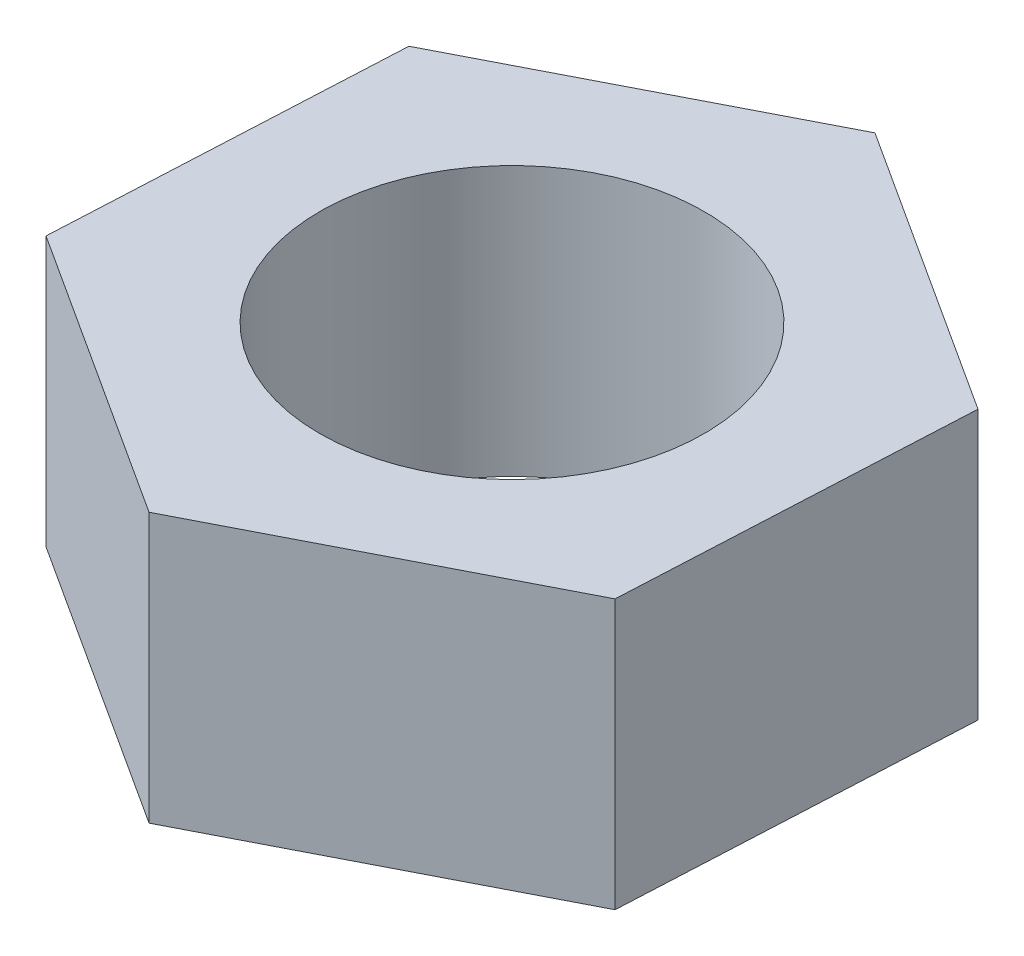
ISO-10303-21;
HEADER;
FILE_DESCRIPTION(('STEP AP214'),'2;1');
FILE_NAME('part.step','',(''),(''),'','','');
FILE_SCHEMA(('AUTOMOTIVE_DESIGN { 1 0 10303 214 1 1 1 1 }'));
ENDSEC;
DATA;
#1=APPLICATION_CONTEXT('core data for automotive mechanical design processes');
#2=APPLICATION_PROTOCOL_DEFINITION('international standard','automotive_design',2000,#1);
#3=PRODUCT_CONTEXT('',#1,'mechanical');
#4=PRODUCT('Part','Part','',(#3));
#5=PRODUCT_RELATED_PRODUCT_CATEGORY('part','',(#4));
#6=PRODUCT_DEFINITION_FORMATION('','',#4);
#7=PRODUCT_DEFINITION_CONTEXT('part definition',#1,'design');
#8=PRODUCT_DEFINITION('design','',#6,#7);
#9=PRODUCT_DEFINITION_SHAPE('','',#8);
#10=(LENGTH_UNIT() NAMED_UNIT(*) SI_UNIT(.MILLI.,.METRE.));
#11=(NAMED_UNIT(*) PLANE_ANGLE_UNIT() SI_UNIT($,.RADIAN.));
#12=(NAMED_UNIT(*) SI_UNIT($,.STERADIAN.) SOLID_ANGLE_UNIT());
#13=UNCERTAINTY_MEASURE_WITH_UNIT(LENGTH_MEASURE(1.E-05),#10,'distance_accuracy_value','');
#14=(GEOMETRIC_REPRESENTATION_CONTEXT(3) GLOBAL_UNCERTAINTY_ASSIGNED_CONTEXT((#13)) GLOBAL_UNIT_ASSIGNED_CONTEXT((#10,
#11,#12)) REPRESENTATION_CONTEXT('',''));
#15=CARTESIAN_POINT('',(0.,0.,0.));
#16=DIRECTION('',(0.,0.,1.));
#17=DIRECTION('',(1.,0.,0.));
#18=AXIS2_PLACEMENT_3D('',#15,#16,#17);
#19=CARTESIAN_POINT('',(-0.223564758111544,3.5,4.49444310220193));
#20=DIRECTION('',(-0.456357509152321,0.,-0.889796506983641));
#21=DIRECTION('',(-0.889796506983641,0.,0.456357509152321));
#22=AXIS2_PLACEMENT_3D('',#19,#20,#21);
#23=PLANE('',#22);
#24=DIRECTION('',(0.889796506983641,0.,-0.456357509152321));
#25=VECTOR('',#24,1.);
#26=CARTESIAN_POINT('',(-0.223564758111544,0.,4.49444310220193));
#27=LINE('',#26,#25);
#28=CARTESIAN_POINT('',(-0.223564758111544,0.,4.49444310220193));
#29=VERTEX_POINT('',#28);
#30=CARTESIAN_POINT('',(3.78051952331484,0.,2.44083431101649));
#31=VERTEX_POINT('',#30);
#32=EDGE_CURVE('E117',#29,#31,#27,.T.);
#33=ORIENTED_EDGE('',*,*,#32,.T.);
#34=DIRECTION('',(0.,-1.,0.));
#35=VECTOR('',#34,1.);
#36=CARTESIAN_POINT('',(3.78051952331484,3.5,2.44083431101649));
#37=LINE('',#36,#35);
#38=CARTESIAN_POINT('',(3.78051952331484,3.5,2.44083431101649));
#39=VERTEX_POINT('',#38);
#40=EDGE_CURVE('E11',#39,#31,#37,.T.);
#41=ORIENTED_EDGE('',*,*,#40,.F.);
#42=DIRECTION('',(0.889796506983641,0.,-0.456357509152321));
#43=VECTOR('',#42,1.);
#44=CARTESIAN_POINT('',(-0.223564758111544,3.5,4.49444310220193));
#45=LINE('',#44,#43);
#46=CARTESIAN_POINT('',(-0.223564758111544,3.5,4.49444310220193));
#47=VERTEX_POINT('',#46);
#48=EDGE_CURVE('E128',#47,#39,#45,.T.);
#49=ORIENTED_EDGE('',*,*,#48,.F.);
#50=DIRECTION('',(0.,-1.,0.));
#51=VECTOR('',#50,1.);
#52=CARTESIAN_POINT('',(-0.223564758111544,3.5,4.49444310220193));
#53=LINE('',#52,#51);
#54=EDGE_CURVE('E113',#47,#29,#53,.T.);
#55=ORIENTED_EDGE('',*,*,#54,.T.);
#56=EDGE_LOOP('',(#33,#41,#49,#55));
#57=FACE_BOUND('',#56,.T.);
#58=ADVANCED_FACE('F33',(#57),#23,.F.);
#59=CARTESIAN_POINT('',(3.78051952331484,3.5,2.44083431101649));
#60=DIRECTION('',(-0.998765133822652,0.,-0.0496810573581209));
#61=DIRECTION('',(-0.0496810573581209,0.,0.998765133822652));
#62=AXIS2_PLACEMENT_3D('',#59,#60,#61);
#63=PLANE('',#62);
#64=DIRECTION('',(0.0496810573581209,0.,-0.998765133822652));
#65=VECTOR('',#64,1.);
#66=CARTESIAN_POINT('',(3.78051952331484,0.,2.44083431101649));
#67=LINE('',#66,#65);
#68=CARTESIAN_POINT('',(4.00408428142638,0.,-2.05360879118544));
#69=VERTEX_POINT('',#68);
#70=EDGE_CURVE('E120',#31,#69,#67,.T.);
#71=ORIENTED_EDGE('',*,*,#70,.T.);
#72=DIRECTION('',(0.,-1.,0.));
#73=VECTOR('',#72,1.);
#74=CARTESIAN_POINT('',(4.00408428142638,3.5,-2.05360879118544));
#75=LINE('',#74,#73);
#76=CARTESIAN_POINT('',(4.00408428142638,3.5,-2.05360879118544));
#77=VERTEX_POINT('',#76);
#78=EDGE_CURVE('E41',#77,#69,#75,.T.);
#79=ORIENTED_EDGE('',*,*,#78,.F.);
#80=DIRECTION('',(0.0496810573581209,0.,-0.998765133822652));
#81=VECTOR('',#80,1.);
#82=CARTESIAN_POINT('',(3.78051952331484,3.5,2.44083431101649));
#83=LINE('',#82,#81);
#84=EDGE_CURVE('E86',#39,#77,#83,.T.);
#85=ORIENTED_EDGE('',*,*,#84,.F.);
#86=ORIENTED_EDGE('',*,*,#40,.T.);
#87=EDGE_LOOP('',(#71,#79,#85,#86));
#88=FACE_BOUND('',#87,.T.);
#89=ADVANCED_FACE('F153',(#88),#63,.F.);
#90=CARTESIAN_POINT('',(4.00408428142638,3.5,-2.05360879118544));
#91=DIRECTION('',(-0.54240762467033,0.,0.84011544962552));
#92=DIRECTION('',(0.84011544962552,0.,0.54240762467033));
#93=AXIS2_PLACEMENT_3D('',#90,#91,#92);
#94=PLANE('',#93);
#95=DIRECTION('',(-0.84011544962552,0.,-0.54240762467033));
#96=VECTOR('',#95,1.);
#97=CARTESIAN_POINT('',(4.00408428142638,0.,-2.05360879118544));
#98=LINE('',#97,#96);
#99=CARTESIAN_POINT('',(0.223564758111543,0.,-4.49444310220193));
#100=VERTEX_POINT('',#99);
#101=EDGE_CURVE('E123',#69,#100,#98,.T.);
#102=ORIENTED_EDGE('',*,*,#101,.T.);
#103=DIRECTION('',(0.,-1.,0.));
#104=VECTOR('',#103,1.);
#105=CARTESIAN_POINT('',(0.223564758111543,3.5,-4.49444310220193));
#106=LINE('',#105,#104);
#107=CARTESIAN_POINT('',(0.223564758111543,3.5,-4.49444310220193));
#108=VERTEX_POINT('',#107);
#109=EDGE_CURVE('E108',#108,#100,#106,.T.);
#110=ORIENTED_EDGE('',*,*,#109,.F.);
#111=DIRECTION('',(-0.84011544962552,0.,-0.54240762467033));
#112=VECTOR('',#111,1.);
#113=CARTESIAN_POINT('',(4.00408428142638,3.5,-2.05360879118544));
#114=LINE('',#113,#112);
#115=EDGE_CURVE('E99',#77,#108,#114,.T.);
#116=ORIENTED_EDGE('',*,*,#115,.F.);
#117=ORIENTED_EDGE('',*,*,#78,.T.);
#118=EDGE_LOOP('',(#102,#110,#116,#117));
#119=FACE_BOUND('',#118,.T.);
#120=ADVANCED_FACE('F134',(#119),#94,.F.);
#121=CARTESIAN_POINT('',(0.223564758111543,3.5,-4.49444310220193));
#122=DIRECTION('',(0.456357509152321,0.,0.889796506983641));
#123=DIRECTION('',(0.889796506983641,0.,-0.456357509152321));
#124=AXIS2_PLACEMENT_3D('',#121,#122,#123);
#125=PLANE('',#124);
#126=DIRECTION('',(-0.889796506983641,0.,0.456357509152321));
#127=VECTOR('',#126,1.);
#128=CARTESIAN_POINT('',(0.223564758111543,0.,-4.49444310220193));
#129=LINE('',#128,#127);
#130=CARTESIAN_POINT('',(-3.78051952331484,0.,-2.44083431101649));
#131=VERTEX_POINT('',#130);
#132=EDGE_CURVE('E107',#100,#131,#129,.T.);
#133=ORIENTED_EDGE('',*,*,#132,.T.);
#134=DIRECTION('',(0.,-1.,0.));
#135=VECTOR('',#134,1.);
#136=CARTESIAN_POINT('',(-3.78051952331484,3.5,-2.44083431101649));
#137=LINE('',#136,#135);
#138=CARTESIAN_POINT('',(-3.78051952331484,3.5,-2.44083431101649));
#139=VERTEX_POINT('',#138);
#140=EDGE_CURVE('E104',#139,#131,#137,.T.);
#141=ORIENTED_EDGE('',*,*,#140,.F.);
#142=DIRECTION('',(-0.889796506983641,0.,0.456357509152321));
#143=VECTOR('',#142,1.);
#144=CARTESIAN_POINT('',(0.223564758111543,3.5,-4.49444310220193));
#145=LINE('',#144,#143);
#146=EDGE_CURVE('E93',#108,#139,#145,.T.);
#147=ORIENTED_EDGE('',*,*,#146,.F.);
#148=ORIENTED_EDGE('',*,*,#109,.T.);
#149=EDGE_LOOP('',(#133,#141,#147,#148));
#150=FACE_BOUND('',#149,.T.);
#151=ADVANCED_FACE('F105',(#150),#125,.F.);
#152=CARTESIAN_POINT('',(-3.78051952331484,3.5,-2.44083431101649));
#153=DIRECTION('',(0.998765133822652,0.,0.049681057358121));
#154=DIRECTION('',(0.049681057358121,0.,-0.998765133822652));
#155=AXIS2_PLACEMENT_3D('',#152,#153,#154);
#156=PLANE('',#155);
#157=DIRECTION('',(-0.049681057358121,0.,0.998765133822652));
#158=VECTOR('',#157,1.);
#159=CARTESIAN_POINT('',(-3.78051952331484,0.,-2.44083431101649));
#160=LINE('',#159,#158);
#161=CARTESIAN_POINT('',(-4.00408428142638,0.,2.05360879118544));
#162=VERTEX_POINT('',#161);
#163=EDGE_CURVE('E72',#131,#162,#160,.T.);
#164=ORIENTED_EDGE('',*,*,#163,.T.);
#165=DIRECTION('',(0.,-1.,0.));
#166=VECTOR('',#165,1.);
#167=CARTESIAN_POINT('',(-4.00408428142638,3.5,2.05360879118544));
#168=LINE('',#167,#166);
#169=CARTESIAN_POINT('',(-4.00408428142638,3.5,2.05360879118544));
#170=VERTEX_POINT('',#169);
#171=EDGE_CURVE('E109',#170,#162,#168,.T.);
#172=ORIENTED_EDGE('',*,*,#171,.F.);
#173=DIRECTION('',(-0.049681057358121,0.,0.998765133822652));
#174=VECTOR('',#173,1.);
#175=CARTESIAN_POINT('',(-3.78051952331484,3.5,-2.44083431101649));
#176=LINE('',#175,#174);
#177=EDGE_CURVE('E97',#139,#170,#176,.T.);
#178=ORIENTED_EDGE('',*,*,#177,.F.);
#179=ORIENTED_EDGE('',*,*,#140,.T.);
#180=EDGE_LOOP('',(#164,#172,#178,#179));
#181=FACE_BOUND('',#180,.T.);
#182=ADVANCED_FACE('F111',(#181),#156,.F.);
#183=CARTESIAN_POINT('',(-4.00408428142638,3.5,2.05360879118544));
#184=DIRECTION('',(0.54240762467033,0.,-0.84011544962552));
#185=DIRECTION('',(-0.84011544962552,0.,-0.54240762467033));
#186=AXIS2_PLACEMENT_3D('',#183,#184,#185);
#187=PLANE('',#186);
#188=DIRECTION('',(0.84011544962552,0.,0.54240762467033));
#189=VECTOR('',#188,1.);
#190=CARTESIAN_POINT('',(-4.00408428142638,0.,2.05360879118544));
#191=LINE('',#190,#189);
#192=EDGE_CURVE('E78',#162,#29,#191,.T.);
#193=ORIENTED_EDGE('',*,*,#192,.T.);
#194=ORIENTED_EDGE('',*,*,#54,.F.);
#195=DIRECTION('',(0.84011544962552,0.,0.54240762467033));
#196=VECTOR('',#195,1.);
#197=CARTESIAN_POINT('',(-4.00408428142638,3.5,2.05360879118544));
#198=LINE('',#197,#196);
#199=EDGE_CURVE('E49',#170,#47,#198,.T.);
#200=ORIENTED_EDGE('',*,*,#199,.F.);
#201=ORIENTED_EDGE('',*,*,#171,.T.);
#202=EDGE_LOOP('',(#193,#194,#200,#201));
#203=FACE_BOUND('',#202,.T.);
#204=ADVANCED_FACE('F141',(#203),#187,.F.);
#205=CARTESIAN_POINT('',(3.78051952331484,3.5,2.44083431101649));
#206=DIRECTION('',(0.,1.,0.));
#207=DIRECTION('',(0.,0.,1.));
#208=AXIS2_PLACEMENT_3D('',#205,#206,#207);
#209=PLANE('',#208);
#210=CARTESIAN_POINT('',(0.,3.5,0.));
#211=DIRECTION('',(0.,1.,0.));
#212=DIRECTION('',(0.,0.,1.));
#213=AXIS2_PLACEMENT_3D('',#210,#211,#212);
#214=CIRCLE('',#213,2.5);
#215=CARTESIAN_POINT('',(0.,3.5,2.5));
#216=VERTEX_POINT('',#215);
#217=EDGE_CURVE('E208',#216,#216,#214,.T.);
#218=ORIENTED_EDGE('',*,*,#217,.F.);
#219=EDGE_LOOP('',(#218));
#220=FACE_BOUND('',#219,.T.);
#221=ORIENTED_EDGE('',*,*,#48,.T.);
#222=ORIENTED_EDGE('',*,*,#84,.T.);
#223=ORIENTED_EDGE('',*,*,#115,.T.);
#224=ORIENTED_EDGE('',*,*,#146,.T.);
#225=ORIENTED_EDGE('',*,*,#177,.T.);
#226=ORIENTED_EDGE('',*,*,#199,.T.);
#227=EDGE_LOOP('',(#221,#222,#223,#224,#225,#226));
#228=FACE_BOUND('',#227,.T.);
#229=ADVANCED_FACE('F95',(#220,#228),#209,.T.);
#230=CARTESIAN_POINT('',(3.78051952331484,0.,2.44083431101649));
#231=DIRECTION('',(0.,1.,0.));
#232=DIRECTION('',(0.,0.,1.));
#233=AXIS2_PLACEMENT_3D('',#230,#231,#232);
#234=PLANE('',#233);
#235=CARTESIAN_POINT('',(0.,0.,0.));
#236=DIRECTION('',(0.,1.,0.));
#237=DIRECTION('',(0.,0.,1.));
#238=AXIS2_PLACEMENT_3D('',#235,#236,#237);
#239=CIRCLE('',#238,2.5);
#240=CARTESIAN_POINT('',(0.,0.,2.5));
#241=VERTEX_POINT('',#240);
#242=EDGE_CURVE('E121',#241,#241,#239,.T.);
#243=ORIENTED_EDGE('',*,*,#242,.T.);
#244=EDGE_LOOP('',(#243));
#245=FACE_BOUND('',#244,.T.);
#246=ORIENTED_EDGE('',*,*,#32,.F.);
#247=ORIENTED_EDGE('',*,*,#192,.F.);
#248=ORIENTED_EDGE('',*,*,#163,.F.);
#249=ORIENTED_EDGE('',*,*,#132,.F.);
#250=ORIENTED_EDGE('',*,*,#101,.F.);
#251=ORIENTED_EDGE('',*,*,#70,.F.);
#252=EDGE_LOOP('',(#246,#247,#248,#249,#250,#251));
#253=FACE_BOUND('',#252,.T.);
#254=ADVANCED_FACE('F137',(#245,#253),#234,.F.);
#255=CARTESIAN_POINT('',(0.,0.,0.));
#256=DIRECTION('',(0.,1.,0.));
#257=DIRECTION('',(0.,0.,1.));
#258=AXIS2_PLACEMENT_3D('',#255,#256,#257);
#259=CYLINDRICAL_SURFACE('',#258,2.5);
#260=ORIENTED_EDGE('',*,*,#242,.F.);
#261=EDGE_LOOP('',(#260));
#262=FACE_BOUND('',#261,.T.);
#263=ORIENTED_EDGE('',*,*,#217,.T.);
#264=EDGE_LOOP('',(#263));
#265=FACE_BOUND('',#264,.T.);
#266=ADVANCED_FACE('F190',(#262,#265),#259,.F.);
#267=CLOSED_SHELL('',(#58,#89,#120,#151,#182,#204,#229,#254,#266));
#268=MANIFOLD_SOLID_BREP('B2',#267);
#269=ADVANCED_BREP_SHAPE_REPRESENTATION('',(#18,#268),#14);
#270=SHAPE_DEFINITION_REPRESENTATION(#9,#269);
ENDSEC;
END-ISO-10303-21;
